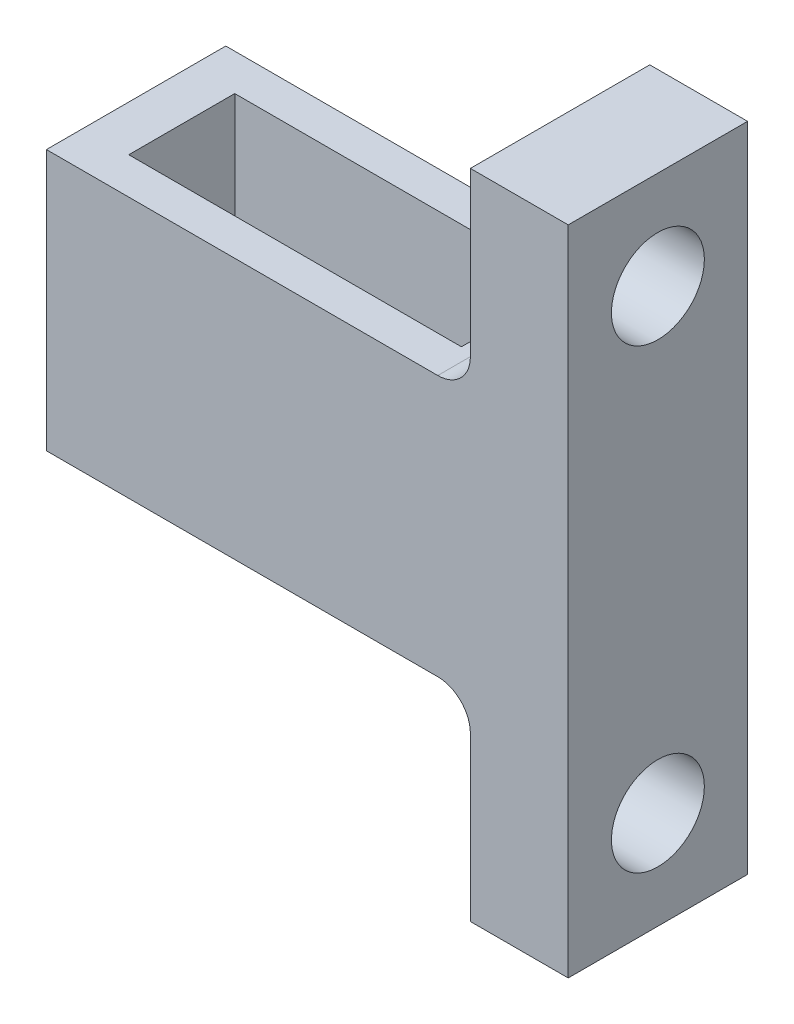
ISO-10303-21;
HEADER;
FILE_DESCRIPTION(('STEP AP214'),'2;1');
FILE_NAME('part.step','',(''),(''),'','','');
FILE_SCHEMA(('AUTOMOTIVE_DESIGN { 1 0 10303 214 1 1 1 1 }'));
ENDSEC;
DATA;
#1=APPLICATION_CONTEXT('core data for automotive mechanical design processes');
#2=APPLICATION_PROTOCOL_DEFINITION('international standard','automotive_design',2000,#1);
#3=PRODUCT_CONTEXT('',#1,'mechanical');
#4=PRODUCT('Part','Part','',(#3));
#5=PRODUCT_RELATED_PRODUCT_CATEGORY('part','',(#4));
#6=PRODUCT_DEFINITION_FORMATION('','',#4);
#7=PRODUCT_DEFINITION_CONTEXT('part definition',#1,'design');
#8=PRODUCT_DEFINITION('design','',#6,#7);
#9=PRODUCT_DEFINITION_SHAPE('','',#8);
#10=(LENGTH_UNIT() NAMED_UNIT(*) SI_UNIT(.MILLI.,.METRE.));
#11=(NAMED_UNIT(*) PLANE_ANGLE_UNIT() SI_UNIT($,.RADIAN.));
#12=(NAMED_UNIT(*) SI_UNIT($,.STERADIAN.) SOLID_ANGLE_UNIT());
#13=UNCERTAINTY_MEASURE_WITH_UNIT(LENGTH_MEASURE(1.E-05),#10,'distance_accuracy_value','');
#14=(GEOMETRIC_REPRESENTATION_CONTEXT(3) GLOBAL_UNCERTAINTY_ASSIGNED_CONTEXT((#13)) GLOBAL_UNIT_ASSIGNED_CONTEXT((#10,
#11,#12)) REPRESENTATION_CONTEXT('',''));
#15=CARTESIAN_POINT('',(0.,0.,0.));
#16=DIRECTION('',(0.,0.,1.));
#17=DIRECTION('',(1.,0.,0.));
#18=AXIS2_PLACEMENT_3D('',#15,#16,#17);
#19=CARTESIAN_POINT('',(0.,10.,0.));
#20=DIRECTION('',(0.,-1.,0.));
#21=DIRECTION('',(0.,0.,-1.));
#22=AXIS2_PLACEMENT_3D('',#19,#20,#21);
#23=PLANE('',#22);
#24=DIRECTION('',(1.,0.,0.));
#25=VECTOR('',#24,1.);
#26=CARTESIAN_POINT('',(-13.,10.,5.5));
#27=LINE('',#26,#25);
#28=CARTESIAN_POINT('',(-13.,10.,5.5));
#29=VERTEX_POINT('',#28);
#30=CARTESIAN_POINT('',(11.,10.,5.5));
#31=VERTEX_POINT('',#30);
#32=EDGE_CURVE('E367',#29,#31,#27,.T.);
#33=ORIENTED_EDGE('',*,*,#32,.T.);
#34=DIRECTION('',(0.,0.,-1.));
#35=VECTOR('',#34,1.);
#36=CARTESIAN_POINT('',(11.,10.,-5.5));
#37=LINE('',#36,#35);
#38=CARTESIAN_POINT('',(11.,10.,-5.5));
#39=VERTEX_POINT('',#38);
#40=EDGE_CURVE('E379',#31,#39,#37,.T.);
#41=ORIENTED_EDGE('',*,*,#40,.T.);
#42=DIRECTION('',(-1.,0.,0.));
#43=VECTOR('',#42,1.);
#44=CARTESIAN_POINT('',(-13.,10.,-5.5));
#45=LINE('',#44,#43);
#46=CARTESIAN_POINT('',(-13.,10.,-5.5));
#47=VERTEX_POINT('',#46);
#48=EDGE_CURVE('E363',#39,#47,#45,.T.);
#49=ORIENTED_EDGE('',*,*,#48,.T.);
#50=DIRECTION('',(0.,0.,1.));
#51=VECTOR('',#50,1.);
#52=CARTESIAN_POINT('',(-13.,10.,5.5));
#53=LINE('',#52,#51);
#54=EDGE_CURVE('E365',#47,#29,#53,.T.);
#55=ORIENTED_EDGE('',*,*,#54,.T.);
#56=EDGE_LOOP('',(#33,#41,#49,#55));
#57=FACE_BOUND('',#56,.T.);
#58=DIRECTION('',(0.,0.,-1.));
#59=VECTOR('',#58,1.);
#60=CARTESIAN_POINT('',(10.2,10.,3.25));
#61=LINE('',#60,#59);
#62=CARTESIAN_POINT('',(10.2,10.,3.25));
#63=VERTEX_POINT('',#62);
#64=CARTESIAN_POINT('',(10.2,10.,-3.25));
#65=VERTEX_POINT('',#64);
#66=EDGE_CURVE('E330',#63,#65,#61,.T.);
#67=ORIENTED_EDGE('',*,*,#66,.F.);
#68=DIRECTION('',(1.,0.,0.));
#69=VECTOR('',#68,1.);
#70=CARTESIAN_POINT('',(-10.2,10.,3.25));
#71=LINE('',#70,#69);
#72=CARTESIAN_POINT('',(-10.2,10.,3.25));
#73=VERTEX_POINT('',#72);
#74=EDGE_CURVE('E338',#73,#63,#71,.T.);
#75=ORIENTED_EDGE('',*,*,#74,.F.);
#76=DIRECTION('',(0.,0.,1.));
#77=VECTOR('',#76,1.);
#78=CARTESIAN_POINT('',(-10.2,10.,3.25));
#79=LINE('',#78,#77);
#80=CARTESIAN_POINT('',(-10.2,10.,-3.25));
#81=VERTEX_POINT('',#80);
#82=EDGE_CURVE('E335',#81,#73,#79,.T.);
#83=ORIENTED_EDGE('',*,*,#82,.F.);
#84=DIRECTION('',(-1.,0.,0.));
#85=VECTOR('',#84,1.);
#86=CARTESIAN_POINT('',(-10.2,10.,-3.25));
#87=LINE('',#86,#85);
#88=EDGE_CURVE('E332',#65,#81,#87,.T.);
#89=ORIENTED_EDGE('',*,*,#88,.F.);
#90=EDGE_LOOP('',(#67,#75,#83,#89));
#91=FACE_BOUND('',#90,.T.);
#92=ADVANCED_FACE('F36',(#57,#91),#23,.F.);
#93=CARTESIAN_POINT('',(-13.,10.,-5.5));
#94=DIRECTION('',(0.,0.,1.));
#95=DIRECTION('',(1.,0.,0.));
#96=AXIS2_PLACEMENT_3D('',#93,#94,#95);
#97=PLANE('',#96);
#98=ORIENTED_EDGE('',*,*,#48,.F.);
#99=CARTESIAN_POINT('',(11.,12.,-5.5));
#100=DIRECTION('',(0.,0.,1.));
#101=DIRECTION('',(1.,0.,0.));
#102=AXIS2_PLACEMENT_3D('',#99,#100,#101);
#103=CIRCLE('',#102,2.);
#104=CARTESIAN_POINT('',(13.,12.,-5.5));
#105=VERTEX_POINT('',#104);
#106=EDGE_CURVE('E44',#39,#105,#103,.T.);
#107=ORIENTED_EDGE('',*,*,#106,.T.);
#108=DIRECTION('',(0.,1.,0.));
#109=VECTOR('',#108,1.);
#110=CARTESIAN_POINT('',(13.,22.,-5.5));
#111=LINE('',#110,#109);
#112=CARTESIAN_POINT('',(13.,22.,-5.5));
#113=VERTEX_POINT('',#112);
#114=EDGE_CURVE('E416',#105,#113,#111,.T.);
#115=ORIENTED_EDGE('',*,*,#114,.T.);
#116=DIRECTION('',(-1.,0.,0.));
#117=VECTOR('',#116,1.);
#118=CARTESIAN_POINT('',(19.,22.,-5.5));
#119=LINE('',#118,#117);
#120=CARTESIAN_POINT('',(19.,22.,-5.5));
#121=VERTEX_POINT('',#120);
#122=EDGE_CURVE('E240',#121,#113,#119,.T.);
#123=ORIENTED_EDGE('',*,*,#122,.F.);
#124=DIRECTION('',(0.,1.,0.));
#125=VECTOR('',#124,1.);
#126=CARTESIAN_POINT('',(19.,22.,-5.5));
#127=LINE('',#126,#125);
#128=CARTESIAN_POINT('',(19.,-18.,-5.5));
#129=VERTEX_POINT('',#128);
#130=EDGE_CURVE('E217',#129,#121,#127,.T.);
#131=ORIENTED_EDGE('',*,*,#130,.F.);
#132=DIRECTION('',(-1.,0.,0.));
#133=VECTOR('',#132,1.);
#134=CARTESIAN_POINT('',(19.,-18.,-5.5));
#135=LINE('',#134,#133);
#136=CARTESIAN_POINT('',(13.,-18.,-5.5));
#137=VERTEX_POINT('',#136);
#138=EDGE_CURVE('E214',#129,#137,#135,.T.);
#139=ORIENTED_EDGE('',*,*,#138,.T.);
#140=CARTESIAN_POINT('',(13.,-8.,-5.5));
#141=VERTEX_POINT('',#140);
#142=EDGE_CURVE('E392',#137,#141,#111,.T.);
#143=ORIENTED_EDGE('',*,*,#142,.T.);
#144=CARTESIAN_POINT('',(11.,-8.,-5.5));
#145=DIRECTION('',(0.,0.,1.));
#146=DIRECTION('',(1.,0.,0.));
#147=AXIS2_PLACEMENT_3D('',#144,#145,#146);
#148=CIRCLE('',#147,2.);
#149=CARTESIAN_POINT('',(11.,-6.,-5.5));
#150=VERTEX_POINT('',#149);
#151=EDGE_CURVE('E385',#141,#150,#148,.T.);
#152=ORIENTED_EDGE('',*,*,#151,.T.);
#153=DIRECTION('',(1.,0.,0.));
#154=VECTOR('',#153,1.);
#155=CARTESIAN_POINT('',(-13.,-6.,-5.5));
#156=LINE('',#155,#154);
#157=CARTESIAN_POINT('',(-13.,-6.,-5.5));
#158=VERTEX_POINT('',#157);
#159=EDGE_CURVE('E324',#158,#150,#156,.T.);
#160=ORIENTED_EDGE('',*,*,#159,.F.);
#161=DIRECTION('',(0.,-1.,0.));
#162=VECTOR('',#161,1.);
#163=CARTESIAN_POINT('',(-13.,10.,-5.5));
#164=LINE('',#163,#162);
#165=EDGE_CURVE('E372',#47,#158,#164,.T.);
#166=ORIENTED_EDGE('',*,*,#165,.F.);
#167=EDGE_LOOP('',(#98,#107,#115,#123,#131,#139,#143,#152,#160,#166));
#168=FACE_BOUND('',#167,.T.);
#169=ADVANCED_FACE('F389',(#168),#97,.F.);
#170=CARTESIAN_POINT('',(-13.,10.,5.5));
#171=DIRECTION('',(1.,0.,0.));
#172=DIRECTION('',(0.,0.,-1.));
#173=AXIS2_PLACEMENT_3D('',#170,#171,#172);
#174=PLANE('',#173);
#175=ORIENTED_EDGE('',*,*,#165,.T.);
#176=DIRECTION('',(0.,0.,-1.));
#177=VECTOR('',#176,1.);
#178=CARTESIAN_POINT('',(-13.,-6.,5.5));
#179=LINE('',#178,#177);
#180=CARTESIAN_POINT('',(-13.,-6.,5.5));
#181=VERTEX_POINT('',#180);
#182=EDGE_CURVE('E321',#181,#158,#179,.T.);
#183=ORIENTED_EDGE('',*,*,#182,.F.);
#184=DIRECTION('',(0.,-1.,0.));
#185=VECTOR('',#184,1.);
#186=CARTESIAN_POINT('',(-13.,10.,5.5));
#187=LINE('',#186,#185);
#188=EDGE_CURVE('E370',#29,#181,#187,.T.);
#189=ORIENTED_EDGE('',*,*,#188,.F.);
#190=ORIENTED_EDGE('',*,*,#54,.F.);
#191=EDGE_LOOP('',(#175,#183,#189,#190));
#192=FACE_BOUND('',#191,.T.);
#193=ADVANCED_FACE('F436',(#192),#174,.F.);
#194=CARTESIAN_POINT('',(-13.,10.,5.5));
#195=DIRECTION('',(0.,0.,-1.));
#196=DIRECTION('',(-1.,0.,0.));
#197=AXIS2_PLACEMENT_3D('',#194,#195,#196);
#198=PLANE('',#197);
#199=ORIENTED_EDGE('',*,*,#188,.T.);
#200=DIRECTION('',(-1.,0.,0.));
#201=VECTOR('',#200,1.);
#202=CARTESIAN_POINT('',(-13.,-6.,5.5));
#203=LINE('',#202,#201);
#204=CARTESIAN_POINT('',(11.,-6.,5.5));
#205=VERTEX_POINT('',#204);
#206=EDGE_CURVE('E327',#205,#181,#203,.T.);
#207=ORIENTED_EDGE('',*,*,#206,.F.);
#208=CARTESIAN_POINT('',(11.,-8.,5.5));
#209=DIRECTION('',(0.,0.,-1.));
#210=DIRECTION('',(-1.,0.,0.));
#211=AXIS2_PLACEMENT_3D('',#208,#209,#210);
#212=CIRCLE('',#211,2.);
#213=CARTESIAN_POINT('',(13.,-8.,5.5));
#214=VERTEX_POINT('',#213);
#215=EDGE_CURVE('E383',#205,#214,#212,.T.);
#216=ORIENTED_EDGE('',*,*,#215,.T.);
#217=DIRECTION('',(0.,-1.,0.));
#218=VECTOR('',#217,1.);
#219=CARTESIAN_POINT('',(13.,22.,5.50000000000001));
#220=LINE('',#219,#218);
#221=CARTESIAN_POINT('',(13.,-18.,5.5));
#222=VERTEX_POINT('',#221);
#223=EDGE_CURVE('E233',#214,#222,#220,.T.);
#224=ORIENTED_EDGE('',*,*,#223,.T.);
#225=DIRECTION('',(-1.,0.,0.));
#226=VECTOR('',#225,1.);
#227=CARTESIAN_POINT('',(19.,-18.,5.5));
#228=LINE('',#227,#226);
#229=CARTESIAN_POINT('',(19.,-18.,5.5));
#230=VERTEX_POINT('',#229);
#231=EDGE_CURVE('E212',#230,#222,#228,.T.);
#232=ORIENTED_EDGE('',*,*,#231,.F.);
#233=DIRECTION('',(0.,-1.,0.));
#234=VECTOR('',#233,1.);
#235=CARTESIAN_POINT('',(19.,22.,5.50000000000001));
#236=LINE('',#235,#234);
#237=CARTESIAN_POINT('',(19.,22.,5.50000000000001));
#238=VERTEX_POINT('',#237);
#239=EDGE_CURVE('E218',#238,#230,#236,.T.);
#240=ORIENTED_EDGE('',*,*,#239,.F.);
#241=DIRECTION('',(-1.,0.,0.));
#242=VECTOR('',#241,1.);
#243=CARTESIAN_POINT('',(19.,22.,5.50000000000001));
#244=LINE('',#243,#242);
#245=CARTESIAN_POINT('',(13.,22.,5.50000000000001));
#246=VERTEX_POINT('',#245);
#247=EDGE_CURVE('E419',#238,#246,#244,.T.);
#248=ORIENTED_EDGE('',*,*,#247,.T.);
#249=CARTESIAN_POINT('',(13.,12.,5.50000000000001));
#250=VERTEX_POINT('',#249);
#251=EDGE_CURVE('E406',#246,#250,#220,.T.);
#252=ORIENTED_EDGE('',*,*,#251,.T.);
#253=CARTESIAN_POINT('',(11.,12.,5.5));
#254=DIRECTION('',(0.,0.,-1.));
#255=DIRECTION('',(-1.,0.,0.));
#256=AXIS2_PLACEMENT_3D('',#253,#254,#255);
#257=CIRCLE('',#256,2.);
#258=EDGE_CURVE('E11',#250,#31,#257,.T.);
#259=ORIENTED_EDGE('',*,*,#258,.T.);
#260=ORIENTED_EDGE('',*,*,#32,.F.);
#261=EDGE_LOOP('',(#199,#207,#216,#224,#232,#240,#248,#252,#259,#260));
#262=FACE_BOUND('',#261,.T.);
#263=ADVANCED_FACE('F231',(#262),#198,.F.);
#264=CARTESIAN_POINT('',(10.2,10.,3.25));
#265=DIRECTION('',(-1.,0.,0.));
#266=DIRECTION('',(0.,0.,1.));
#267=AXIS2_PLACEMENT_3D('',#264,#265,#266);
#268=PLANE('',#267);
#269=DIRECTION('',(0.,0.,-1.));
#270=VECTOR('',#269,1.);
#271=CARTESIAN_POINT('',(10.2,0.,3.25));
#272=LINE('',#271,#270);
#273=CARTESIAN_POINT('',(10.2,0.,3.25));
#274=VERTEX_POINT('',#273);
#275=CARTESIAN_POINT('',(10.2,0.,-3.25));
#276=VERTEX_POINT('',#275);
#277=EDGE_CURVE('E329',#274,#276,#272,.T.);
#278=ORIENTED_EDGE('',*,*,#277,.F.);
#279=DIRECTION('',(0.,-1.,0.));
#280=VECTOR('',#279,1.);
#281=CARTESIAN_POINT('',(10.2,10.,3.25));
#282=LINE('',#281,#280);
#283=EDGE_CURVE('E340',#63,#274,#282,.T.);
#284=ORIENTED_EDGE('',*,*,#283,.F.);
#285=ORIENTED_EDGE('',*,*,#66,.T.);
#286=DIRECTION('',(0.,-1.,0.));
#287=VECTOR('',#286,1.);
#288=CARTESIAN_POINT('',(10.2,10.,-3.25));
#289=LINE('',#288,#287);
#290=EDGE_CURVE('E360',#65,#276,#289,.T.);
#291=ORIENTED_EDGE('',*,*,#290,.T.);
#292=EDGE_LOOP('',(#278,#284,#285,#291));
#293=FACE_BOUND('',#292,.T.);
#294=ADVANCED_FACE('F443',(#293),#268,.T.);
#295=CARTESIAN_POINT('',(-10.2,10.,-3.25));
#296=DIRECTION('',(0.,0.,1.));
#297=DIRECTION('',(1.,0.,0.));
#298=AXIS2_PLACEMENT_3D('',#295,#296,#297);
#299=PLANE('',#298);
#300=DIRECTION('',(-1.,0.,0.));
#301=VECTOR('',#300,1.);
#302=CARTESIAN_POINT('',(-10.2,0.,-3.25));
#303=LINE('',#302,#301);
#304=CARTESIAN_POINT('',(8.7,0.,-3.25));
#305=VERTEX_POINT('',#304);
#306=EDGE_CURVE('E344',#276,#305,#303,.T.);
#307=ORIENTED_EDGE('',*,*,#306,.F.);
#308=ORIENTED_EDGE('',*,*,#290,.F.);
#309=ORIENTED_EDGE('',*,*,#88,.T.);
#310=DIRECTION('',(0.,-1.,0.));
#311=VECTOR('',#310,1.);
#312=CARTESIAN_POINT('',(-10.2,10.,-3.25));
#313=LINE('',#312,#311);
#314=CARTESIAN_POINT('',(-10.2,0.,-3.25));
#315=VERTEX_POINT('',#314);
#316=EDGE_CURVE('E358',#81,#315,#313,.T.);
#317=ORIENTED_EDGE('',*,*,#316,.T.);
#318=CARTESIAN_POINT('',(-8.7,0.,-3.25));
#319=VERTEX_POINT('',#318);
#320=EDGE_CURVE('E343',#319,#315,#303,.T.);
#321=ORIENTED_EDGE('',*,*,#320,.F.);
#322=DIRECTION('',(0.,1.,0.));
#323=VECTOR('',#322,1.);
#324=CARTESIAN_POINT('',(-8.7,-6.,-3.25));
#325=LINE('',#324,#323);
#326=CARTESIAN_POINT('',(-8.7,-6.,-3.25));
#327=VERTEX_POINT('',#326);
#328=EDGE_CURVE('E318',#327,#319,#325,.T.);
#329=ORIENTED_EDGE('',*,*,#328,.F.);
#330=DIRECTION('',(1.,0.,0.));
#331=VECTOR('',#330,1.);
#332=CARTESIAN_POINT('',(-8.7,-6.,-3.25));
#333=LINE('',#332,#331);
#334=CARTESIAN_POINT('',(-6.2,-6.,-3.25));
#335=VERTEX_POINT('',#334);
#336=EDGE_CURVE('E297',#327,#335,#333,.T.);
#337=ORIENTED_EDGE('',*,*,#336,.T.);
#338=DIRECTION('',(0.,1.,0.));
#339=VECTOR('',#338,1.);
#340=CARTESIAN_POINT('',(-6.2,-6.,-3.25));
#341=LINE('',#340,#339);
#342=CARTESIAN_POINT('',(-6.2,0.,-3.25));
#343=VERTEX_POINT('',#342);
#344=EDGE_CURVE('E315',#335,#343,#341,.T.);
#345=ORIENTED_EDGE('',*,*,#344,.T.);
#346=CARTESIAN_POINT('',(-1.5,0.,-3.25));
#347=VERTEX_POINT('',#346);
#348=EDGE_CURVE('E808',#347,#343,#303,.T.);
#349=ORIENTED_EDGE('',*,*,#348,.F.);
#350=DIRECTION('',(0.,1.,0.));
#351=VECTOR('',#350,1.);
#352=CARTESIAN_POINT('',(-1.5,-6.,-3.25));
#353=LINE('',#352,#351);
#354=CARTESIAN_POINT('',(-1.5,-6.,-3.25));
#355=VERTEX_POINT('',#354);
#356=EDGE_CURVE('E291',#355,#347,#353,.T.);
#357=ORIENTED_EDGE('',*,*,#356,.F.);
#358=DIRECTION('',(1.,0.,0.));
#359=VECTOR('',#358,1.);
#360=CARTESIAN_POINT('',(-1.5,-6.,-3.25));
#361=LINE('',#360,#359);
#362=CARTESIAN_POINT('',(0.999999999999999,-6.,-3.25));
#363=VERTEX_POINT('',#362);
#364=EDGE_CURVE('E270',#355,#363,#361,.T.);
#365=ORIENTED_EDGE('',*,*,#364,.T.);
#366=DIRECTION('',(0.,1.,0.));
#367=VECTOR('',#366,1.);
#368=CARTESIAN_POINT('',(0.999999999999999,-6.,-3.25));
#369=LINE('',#368,#367);
#370=CARTESIAN_POINT('',(0.999999999999997,0.,-3.25));
#371=VERTEX_POINT('',#370);
#372=EDGE_CURVE('E288',#363,#371,#369,.T.);
#373=ORIENTED_EDGE('',*,*,#372,.T.);
#374=CARTESIAN_POINT('',(6.2,0.,-3.25));
#375=VERTEX_POINT('',#374);
#376=EDGE_CURVE('E347',#375,#371,#303,.T.);
#377=ORIENTED_EDGE('',*,*,#376,.F.);
#378=DIRECTION('',(0.,1.,0.));
#379=VECTOR('',#378,1.);
#380=CARTESIAN_POINT('',(6.2,-6.,-3.25));
#381=LINE('',#380,#379);
#382=CARTESIAN_POINT('',(6.2,-6.,-3.25));
#383=VERTEX_POINT('',#382);
#384=EDGE_CURVE('E264',#383,#375,#381,.T.);
#385=ORIENTED_EDGE('',*,*,#384,.F.);
#386=DIRECTION('',(1.,0.,0.));
#387=VECTOR('',#386,1.);
#388=CARTESIAN_POINT('',(6.2,-6.,-3.25));
#389=LINE('',#388,#387);
#390=CARTESIAN_POINT('',(8.7,-6.,-3.25));
#391=VERTEX_POINT('',#390);
#392=EDGE_CURVE('E246',#383,#391,#389,.T.);
#393=ORIENTED_EDGE('',*,*,#392,.T.);
#394=DIRECTION('',(0.,1.,0.));
#395=VECTOR('',#394,1.);
#396=CARTESIAN_POINT('',(8.7,-6.,-3.25));
#397=LINE('',#396,#395);
#398=EDGE_CURVE('E261',#391,#305,#397,.T.);
#399=ORIENTED_EDGE('',*,*,#398,.T.);
#400=EDGE_LOOP('',(#307,#308,#309,#317,#321,#329,#337,#345,#349,#357,#365,#373,#377,#385,#393,#399));
#401=FACE_BOUND('',#400,.T.);
#402=ADVANCED_FACE('F453',(#401),#299,.T.);
#403=CARTESIAN_POINT('',(-10.2,10.,3.25));
#404=DIRECTION('',(1.,0.,0.));
#405=DIRECTION('',(0.,0.,-1.));
#406=AXIS2_PLACEMENT_3D('',#403,#404,#405);
#407=PLANE('',#406);
#408=DIRECTION('',(0.,0.,1.));
#409=VECTOR('',#408,1.);
#410=CARTESIAN_POINT('',(-10.2,0.,3.25));
#411=LINE('',#410,#409);
#412=CARTESIAN_POINT('',(-10.2,0.,3.25));
#413=VERTEX_POINT('',#412);
#414=EDGE_CURVE('E346',#315,#413,#411,.T.);
#415=ORIENTED_EDGE('',*,*,#414,.F.);
#416=ORIENTED_EDGE('',*,*,#316,.F.);
#417=ORIENTED_EDGE('',*,*,#82,.T.);
#418=DIRECTION('',(0.,-1.,0.));
#419=VECTOR('',#418,1.);
#420=CARTESIAN_POINT('',(-10.2,10.,3.25));
#421=LINE('',#420,#419);
#422=EDGE_CURVE('E355',#73,#413,#421,.T.);
#423=ORIENTED_EDGE('',*,*,#422,.T.);
#424=EDGE_LOOP('',(#415,#416,#417,#423));
#425=FACE_BOUND('',#424,.T.);
#426=ADVANCED_FACE('F457',(#425),#407,.T.);
#427=CARTESIAN_POINT('',(-10.2,10.,3.25));
#428=DIRECTION('',(0.,0.,-1.));
#429=DIRECTION('',(-1.,0.,0.));
#430=AXIS2_PLACEMENT_3D('',#427,#428,#429);
#431=PLANE('',#430);
#432=DIRECTION('',(1.,0.,0.));
#433=VECTOR('',#432,1.);
#434=CARTESIAN_POINT('',(-10.2,0.,3.25));
#435=LINE('',#434,#433);
#436=CARTESIAN_POINT('',(-8.7,0.,3.25));
#437=VERTEX_POINT('',#436);
#438=EDGE_CURVE('E333',#413,#437,#435,.T.);
#439=ORIENTED_EDGE('',*,*,#438,.F.);
#440=ORIENTED_EDGE('',*,*,#422,.F.);
#441=ORIENTED_EDGE('',*,*,#74,.T.);
#442=ORIENTED_EDGE('',*,*,#283,.T.);
#443=CARTESIAN_POINT('',(8.7,0.,3.25));
#444=VERTEX_POINT('',#443);
#445=EDGE_CURVE('E350',#444,#274,#435,.T.);
#446=ORIENTED_EDGE('',*,*,#445,.F.);
#447=DIRECTION('',(0.,1.,0.));
#448=VECTOR('',#447,1.);
#449=CARTESIAN_POINT('',(8.7,-6.,3.25));
#450=LINE('',#449,#448);
#451=CARTESIAN_POINT('',(8.7,-6.,3.25));
#452=VERTEX_POINT('',#451);
#453=EDGE_CURVE('E258',#452,#444,#450,.T.);
#454=ORIENTED_EDGE('',*,*,#453,.F.);
#455=DIRECTION('',(-1.,0.,0.));
#456=VECTOR('',#455,1.);
#457=CARTESIAN_POINT('',(6.2,-6.,3.25));
#458=LINE('',#457,#456);
#459=CARTESIAN_POINT('',(6.2,-6.,3.25));
#460=VERTEX_POINT('',#459);
#461=EDGE_CURVE('E251',#452,#460,#458,.T.);
#462=ORIENTED_EDGE('',*,*,#461,.T.);
#463=DIRECTION('',(0.,1.,0.));
#464=VECTOR('',#463,1.);
#465=CARTESIAN_POINT('',(6.2,-6.,3.25));
#466=LINE('',#465,#464);
#467=CARTESIAN_POINT('',(6.2,0.,3.25));
#468=VERTEX_POINT('',#467);
#469=EDGE_CURVE('E252',#460,#468,#466,.T.);
#470=ORIENTED_EDGE('',*,*,#469,.T.);
#471=CARTESIAN_POINT('',(0.999999999999997,0.,3.25));
#472=VERTEX_POINT('',#471);
#473=EDGE_CURVE('E791',#472,#468,#435,.T.);
#474=ORIENTED_EDGE('',*,*,#473,.F.);
#475=DIRECTION('',(0.,1.,0.));
#476=VECTOR('',#475,1.);
#477=CARTESIAN_POINT('',(0.999999999999997,-6.,3.25));
#478=LINE('',#477,#476);
#479=CARTESIAN_POINT('',(0.999999999999997,-6.,3.25));
#480=VERTEX_POINT('',#479);
#481=EDGE_CURVE('E285',#480,#472,#478,.T.);
#482=ORIENTED_EDGE('',*,*,#481,.F.);
#483=DIRECTION('',(-1.,0.,0.));
#484=VECTOR('',#483,1.);
#485=CARTESIAN_POINT('',(-1.5,-6.,3.25));
#486=LINE('',#485,#484);
#487=CARTESIAN_POINT('',(-1.5,-6.,3.25));
#488=VERTEX_POINT('',#487);
#489=EDGE_CURVE('E276',#480,#488,#486,.T.);
#490=ORIENTED_EDGE('',*,*,#489,.T.);
#491=DIRECTION('',(0.,1.,0.));
#492=VECTOR('',#491,1.);
#493=CARTESIAN_POINT('',(-1.5,-6.,3.25));
#494=LINE('',#493,#492);
#495=CARTESIAN_POINT('',(-1.5,0.,3.25));
#496=VERTEX_POINT('',#495);
#497=EDGE_CURVE('E278',#488,#496,#494,.T.);
#498=ORIENTED_EDGE('',*,*,#497,.T.);
#499=CARTESIAN_POINT('',(-6.2,0.,3.25));
#500=VERTEX_POINT('',#499);
#501=EDGE_CURVE('E352',#500,#496,#435,.T.);
#502=ORIENTED_EDGE('',*,*,#501,.F.);
#503=DIRECTION('',(0.,1.,0.));
#504=VECTOR('',#503,1.);
#505=CARTESIAN_POINT('',(-6.2,-6.,3.25));
#506=LINE('',#505,#504);
#507=CARTESIAN_POINT('',(-6.2,-6.,3.25));
#508=VERTEX_POINT('',#507);
#509=EDGE_CURVE('E312',#508,#500,#506,.T.);
#510=ORIENTED_EDGE('',*,*,#509,.F.);
#511=DIRECTION('',(-1.,0.,0.));
#512=VECTOR('',#511,1.);
#513=CARTESIAN_POINT('',(-8.7,-6.,3.25));
#514=LINE('',#513,#512);
#515=CARTESIAN_POINT('',(-8.7,-6.,3.25));
#516=VERTEX_POINT('',#515);
#517=EDGE_CURVE('E303',#508,#516,#514,.T.);
#518=ORIENTED_EDGE('',*,*,#517,.T.);
#519=DIRECTION('',(0.,1.,0.));
#520=VECTOR('',#519,1.);
#521=CARTESIAN_POINT('',(-8.7,-6.,3.25));
#522=LINE('',#521,#520);
#523=EDGE_CURVE('E305',#516,#437,#522,.T.);
#524=ORIENTED_EDGE('',*,*,#523,.T.);
#525=EDGE_LOOP('',(#439,#440,#441,#442,#446,#454,#462,#470,#474,#482,#490,#498,#502,#510,#518,#524));
#526=FACE_BOUND('',#525,.T.);
#527=ADVANCED_FACE('F461',(#526),#431,.T.);
#528=CARTESIAN_POINT('',(0.,0.,0.));
#529=DIRECTION('',(0.,-1.,0.));
#530=DIRECTION('',(0.,0.,-1.));
#531=AXIS2_PLACEMENT_3D('',#528,#529,#530);
#532=PLANE('',#531);
#533=DIRECTION('',(0.,0.,1.));
#534=VECTOR('',#533,1.);
#535=CARTESIAN_POINT('',(-6.2,0.,3.25));
#536=LINE('',#535,#534);
#537=EDGE_CURVE('E298',#343,#500,#536,.T.);
#538=ORIENTED_EDGE('',*,*,#537,.T.);
#539=ORIENTED_EDGE('',*,*,#501,.T.);
#540=DIRECTION('',(0.,0.,-1.));
#541=VECTOR('',#540,1.);
#542=CARTESIAN_POINT('',(-1.5,0.,3.25));
#543=LINE('',#542,#541);
#544=EDGE_CURVE('E267',#496,#347,#543,.T.);
#545=ORIENTED_EDGE('',*,*,#544,.T.);
#546=ORIENTED_EDGE('',*,*,#348,.T.);
#547=EDGE_LOOP('',(#538,#539,#545,#546));
#548=FACE_BOUND('',#547,.T.);
#549=ADVANCED_FACE('F465',(#548),#532,.F.);
#550=DIRECTION('',(0.,0.,1.));
#551=VECTOR('',#550,1.);
#552=CARTESIAN_POINT('',(0.999999999999997,0.,3.25));
#553=LINE('',#552,#551);
#554=EDGE_CURVE('E271',#371,#472,#553,.T.);
#555=ORIENTED_EDGE('',*,*,#554,.T.);
#556=ORIENTED_EDGE('',*,*,#473,.T.);
#557=DIRECTION('',(0.,0.,-1.));
#558=VECTOR('',#557,1.);
#559=CARTESIAN_POINT('',(6.2,0.,3.25));
#560=LINE('',#559,#558);
#561=EDGE_CURVE('E235',#468,#375,#560,.T.);
#562=ORIENTED_EDGE('',*,*,#561,.T.);
#563=ORIENTED_EDGE('',*,*,#376,.T.);
#564=EDGE_LOOP('',(#555,#556,#562,#563));
#565=FACE_BOUND('',#564,.T.);
#566=ADVANCED_FACE('F469',(#565),#532,.F.);
#567=DIRECTION('',(0.,0.,1.));
#568=VECTOR('',#567,1.);
#569=CARTESIAN_POINT('',(8.7,0.,3.25));
#570=LINE('',#569,#568);
#571=EDGE_CURVE('E238',#305,#444,#570,.T.);
#572=ORIENTED_EDGE('',*,*,#571,.T.);
#573=ORIENTED_EDGE('',*,*,#445,.T.);
#574=ORIENTED_EDGE('',*,*,#277,.T.);
#575=ORIENTED_EDGE('',*,*,#306,.T.);
#576=EDGE_LOOP('',(#572,#573,#574,#575));
#577=FACE_BOUND('',#576,.T.);
#578=ADVANCED_FACE('F686',(#577),#532,.F.);
#579=ORIENTED_EDGE('',*,*,#414,.T.);
#580=ORIENTED_EDGE('',*,*,#438,.T.);
#581=DIRECTION('',(0.,0.,-1.));
#582=VECTOR('',#581,1.);
#583=CARTESIAN_POINT('',(-8.7,0.,3.25));
#584=LINE('',#583,#582);
#585=EDGE_CURVE('E294',#437,#319,#584,.T.);
#586=ORIENTED_EDGE('',*,*,#585,.T.);
#587=ORIENTED_EDGE('',*,*,#320,.T.);
#588=EDGE_LOOP('',(#579,#580,#586,#587));
#589=FACE_BOUND('',#588,.T.);
#590=ADVANCED_FACE('F471',(#589),#532,.F.);
#591=CARTESIAN_POINT('',(0.,-6.,0.));
#592=DIRECTION('',(0.,-1.,0.));
#593=DIRECTION('',(0.,0.,-1.));
#594=AXIS2_PLACEMENT_3D('',#591,#592,#593);
#595=PLANE('',#594);
#596=ORIENTED_EDGE('',*,*,#159,.T.);
#597=DIRECTION('',(0.,0.,1.));
#598=VECTOR('',#597,1.);
#599=CARTESIAN_POINT('',(11.,-6.,0.));
#600=LINE('',#599,#598);
#601=EDGE_CURVE('E374',#150,#205,#600,.T.);
#602=ORIENTED_EDGE('',*,*,#601,.T.);
#603=ORIENTED_EDGE('',*,*,#206,.T.);
#604=ORIENTED_EDGE('',*,*,#182,.T.);
#605=EDGE_LOOP('',(#596,#602,#603,#604));
#606=FACE_BOUND('',#605,.T.);
#607=ORIENTED_EDGE('',*,*,#336,.F.);
#608=DIRECTION('',(0.,0.,-1.));
#609=VECTOR('',#608,1.);
#610=CARTESIAN_POINT('',(-8.7,-6.,3.25));
#611=LINE('',#610,#609);
#612=EDGE_CURVE('E295',#516,#327,#611,.T.);
#613=ORIENTED_EDGE('',*,*,#612,.F.);
#614=ORIENTED_EDGE('',*,*,#517,.F.);
#615=DIRECTION('',(0.,0.,1.));
#616=VECTOR('',#615,1.);
#617=CARTESIAN_POINT('',(-6.2,-6.,3.25));
#618=LINE('',#617,#616);
#619=EDGE_CURVE('E300',#335,#508,#618,.T.);
#620=ORIENTED_EDGE('',*,*,#619,.F.);
#621=EDGE_LOOP('',(#607,#613,#614,#620));
#622=FACE_BOUND('',#621,.T.);
#623=ORIENTED_EDGE('',*,*,#364,.F.);
#624=DIRECTION('',(0.,0.,-1.));
#625=VECTOR('',#624,1.);
#626=CARTESIAN_POINT('',(-1.5,-6.,3.25));
#627=LINE('',#626,#625);
#628=EDGE_CURVE('E268',#488,#355,#627,.T.);
#629=ORIENTED_EDGE('',*,*,#628,.F.);
#630=ORIENTED_EDGE('',*,*,#489,.F.);
#631=DIRECTION('',(0.,0.,1.));
#632=VECTOR('',#631,1.);
#633=CARTESIAN_POINT('',(0.999999999999997,-6.,3.25));
#634=LINE('',#633,#632);
#635=EDGE_CURVE('E273',#363,#480,#634,.T.);
#636=ORIENTED_EDGE('',*,*,#635,.F.);
#637=EDGE_LOOP('',(#623,#629,#630,#636));
#638=FACE_BOUND('',#637,.T.);
#639=ORIENTED_EDGE('',*,*,#392,.F.);
#640=DIRECTION('',(0.,0.,-1.));
#641=VECTOR('',#640,1.);
#642=CARTESIAN_POINT('',(6.2,-6.,3.25));
#643=LINE('',#642,#641);
#644=EDGE_CURVE('E244',#460,#383,#643,.T.);
#645=ORIENTED_EDGE('',*,*,#644,.F.);
#646=ORIENTED_EDGE('',*,*,#461,.F.);
#647=DIRECTION('',(0.,0.,1.));
#648=VECTOR('',#647,1.);
#649=CARTESIAN_POINT('',(8.7,-6.,3.25));
#650=LINE('',#649,#648);
#651=EDGE_CURVE('E248',#391,#452,#650,.T.);
#652=ORIENTED_EDGE('',*,*,#651,.F.);
#653=EDGE_LOOP('',(#639,#645,#646,#652));
#654=FACE_BOUND('',#653,.T.);
#655=ADVANCED_FACE('F397',(#606,#622,#638,#654),#595,.T.);
#656=CARTESIAN_POINT('',(-8.7,-6.,3.25));
#657=DIRECTION('',(1.,0.,0.));
#658=DIRECTION('',(0.,0.,-1.));
#659=AXIS2_PLACEMENT_3D('',#656,#657,#658);
#660=PLANE('',#659);
#661=ORIENTED_EDGE('',*,*,#585,.F.);
#662=ORIENTED_EDGE('',*,*,#523,.F.);
#663=ORIENTED_EDGE('',*,*,#612,.T.);
#664=ORIENTED_EDGE('',*,*,#328,.T.);
#665=EDGE_LOOP('',(#661,#662,#663,#664));
#666=FACE_BOUND('',#665,.T.);
#667=ADVANCED_FACE('F474',(#666),#660,.T.);
#668=CARTESIAN_POINT('',(-6.2,-6.,3.25));
#669=DIRECTION('',(-1.,0.,0.));
#670=DIRECTION('',(0.,0.,1.));
#671=AXIS2_PLACEMENT_3D('',#668,#669,#670);
#672=PLANE('',#671);
#673=ORIENTED_EDGE('',*,*,#537,.F.);
#674=ORIENTED_EDGE('',*,*,#344,.F.);
#675=ORIENTED_EDGE('',*,*,#619,.T.);
#676=ORIENTED_EDGE('',*,*,#509,.T.);
#677=EDGE_LOOP('',(#673,#674,#675,#676));
#678=FACE_BOUND('',#677,.T.);
#679=ADVANCED_FACE('F477',(#678),#672,.T.);
#680=CARTESIAN_POINT('',(-1.5,-6.,3.25));
#681=DIRECTION('',(1.,0.,0.));
#682=DIRECTION('',(0.,0.,-1.));
#683=AXIS2_PLACEMENT_3D('',#680,#681,#682);
#684=PLANE('',#683);
#685=ORIENTED_EDGE('',*,*,#544,.F.);
#686=ORIENTED_EDGE('',*,*,#497,.F.);
#687=ORIENTED_EDGE('',*,*,#628,.T.);
#688=ORIENTED_EDGE('',*,*,#356,.T.);
#689=EDGE_LOOP('',(#685,#686,#687,#688));
#690=FACE_BOUND('',#689,.T.);
#691=ADVANCED_FACE('F481',(#690),#684,.T.);
#692=CARTESIAN_POINT('',(0.999999999999997,-6.,3.25));
#693=DIRECTION('',(-1.,0.,0.));
#694=DIRECTION('',(0.,0.,1.));
#695=AXIS2_PLACEMENT_3D('',#692,#693,#694);
#696=PLANE('',#695);
#697=ORIENTED_EDGE('',*,*,#554,.F.);
#698=ORIENTED_EDGE('',*,*,#372,.F.);
#699=ORIENTED_EDGE('',*,*,#635,.T.);
#700=ORIENTED_EDGE('',*,*,#481,.T.);
#701=EDGE_LOOP('',(#697,#698,#699,#700));
#702=FACE_BOUND('',#701,.T.);
#703=ADVANCED_FACE('F485',(#702),#696,.T.);
#704=CARTESIAN_POINT('',(6.2,-6.,3.25));
#705=DIRECTION('',(1.,0.,0.));
#706=DIRECTION('',(0.,0.,-1.));
#707=AXIS2_PLACEMENT_3D('',#704,#705,#706);
#708=PLANE('',#707);
#709=ORIENTED_EDGE('',*,*,#561,.F.);
#710=ORIENTED_EDGE('',*,*,#469,.F.);
#711=ORIENTED_EDGE('',*,*,#644,.T.);
#712=ORIENTED_EDGE('',*,*,#384,.T.);
#713=EDGE_LOOP('',(#709,#710,#711,#712));
#714=FACE_BOUND('',#713,.T.);
#715=ADVANCED_FACE('F489',(#714),#708,.T.);
#716=CARTESIAN_POINT('',(8.7,-6.,3.25));
#717=DIRECTION('',(-1.,0.,0.));
#718=DIRECTION('',(0.,0.,1.));
#719=AXIS2_PLACEMENT_3D('',#716,#717,#718);
#720=PLANE('',#719);
#721=ORIENTED_EDGE('',*,*,#571,.F.);
#722=ORIENTED_EDGE('',*,*,#398,.F.);
#723=ORIENTED_EDGE('',*,*,#651,.T.);
#724=ORIENTED_EDGE('',*,*,#453,.T.);
#725=EDGE_LOOP('',(#721,#722,#723,#724));
#726=FACE_BOUND('',#725,.T.);
#727=ADVANCED_FACE('F493',(#726),#720,.T.);
#728=CARTESIAN_POINT('',(13.,0.,0.));
#729=DIRECTION('',(1.,0.,0.));
#730=DIRECTION('',(0.,0.,-1.));
#731=AXIS2_PLACEMENT_3D('',#728,#729,#730);
#732=PLANE('',#731);
#733=ORIENTED_EDGE('',*,*,#223,.F.);
#734=DIRECTION('',(0.,0.,1.));
#735=VECTOR('',#734,1.);
#736=CARTESIAN_POINT('',(13.,-8.,0.));
#737=LINE('',#736,#735);
#738=EDGE_CURVE('E377',#214,#141,#737,.F.);
#739=ORIENTED_EDGE('',*,*,#738,.T.);
#740=ORIENTED_EDGE('',*,*,#142,.F.);
#741=DIRECTION('',(0.,0.,-1.));
#742=VECTOR('',#741,1.);
#743=CARTESIAN_POINT('',(13.,-18.,5.5));
#744=LINE('',#743,#742);
#745=EDGE_CURVE('E405',#222,#137,#744,.T.);
#746=ORIENTED_EDGE('',*,*,#745,.F.);
#747=EDGE_LOOP('',(#733,#739,#740,#746));
#748=FACE_BOUND('',#747,.T.);
#749=CARTESIAN_POINT('',(13.,-11.9957579174975,0.));
#750=DIRECTION('',(1.,0.,0.));
#751=DIRECTION('',(0.,0.,-1.));
#752=AXIS2_PLACEMENT_3D('',#749,#750,#751);
#753=CIRCLE('',#752,2.85);
#754=CARTESIAN_POINT('',(13.,-11.9957579174975,-2.85));
#755=VERTEX_POINT('',#754);
#756=EDGE_CURVE('E410',#755,#755,#753,.T.);
#757=ORIENTED_EDGE('',*,*,#756,.T.);
#758=EDGE_LOOP('',(#757));
#759=FACE_BOUND('',#758,.T.);
#760=ADVANCED_FACE('F403',(#748,#759),#732,.F.);
#761=CARTESIAN_POINT('',(19.,0.,0.));
#762=DIRECTION('',(1.,0.,0.));
#763=DIRECTION('',(0.,0.,-1.));
#764=AXIS2_PLACEMENT_3D('',#761,#762,#763);
#765=PLANE('',#764);
#766=CARTESIAN_POINT('',(19.,-11.9957579174975,0.));
#767=DIRECTION('',(1.,0.,0.));
#768=DIRECTION('',(0.,0.,-1.));
#769=AXIS2_PLACEMENT_3D('',#766,#767,#768);
#770=CIRCLE('',#769,2.85);
#771=CARTESIAN_POINT('',(19.,-11.9957579174975,-2.85));
#772=VERTEX_POINT('',#771);
#773=EDGE_CURVE('E407',#772,#772,#770,.T.);
#774=ORIENTED_EDGE('',*,*,#773,.F.);
#775=EDGE_LOOP('',(#774));
#776=FACE_BOUND('',#775,.T.);
#777=ORIENTED_EDGE('',*,*,#239,.T.);
#778=DIRECTION('',(0.,0.,-1.));
#779=VECTOR('',#778,1.);
#780=CARTESIAN_POINT('',(19.,-18.,5.5));
#781=LINE('',#780,#779);
#782=EDGE_CURVE('E208',#230,#129,#781,.T.);
#783=ORIENTED_EDGE('',*,*,#782,.T.);
#784=ORIENTED_EDGE('',*,*,#130,.T.);
#785=DIRECTION('',(0.,0.,1.));
#786=VECTOR('',#785,1.);
#787=CARTESIAN_POINT('',(19.,22.,5.50000000000001));
#788=LINE('',#787,#786);
#789=EDGE_CURVE('E224',#121,#238,#788,.T.);
#790=ORIENTED_EDGE('',*,*,#789,.T.);
#791=EDGE_LOOP('',(#777,#783,#784,#790));
#792=FACE_BOUND('',#791,.T.);
#793=CARTESIAN_POINT('',(19.,16.,0.));
#794=DIRECTION('',(1.,0.,0.));
#795=DIRECTION('',(0.,0.,-1.));
#796=AXIS2_PLACEMENT_3D('',#793,#794,#795);
#797=CIRCLE('',#796,2.85);
#798=CARTESIAN_POINT('',(19.,16.,-2.85));
#799=VERTEX_POINT('',#798);
#800=EDGE_CURVE('E520',#799,#799,#797,.T.);
#801=ORIENTED_EDGE('',*,*,#800,.F.);
#802=EDGE_LOOP('',(#801));
#803=FACE_BOUND('',#802,.T.);
#804=ADVANCED_FACE('F221',(#776,#792,#803),#765,.T.);
#805=ORIENTED_EDGE('',*,*,#114,.F.);
#806=DIRECTION('',(0.,0.,-1.));
#807=VECTOR('',#806,1.);
#808=CARTESIAN_POINT('',(13.,12.,5.5));
#809=LINE('',#808,#807);
#810=EDGE_CURVE('E57',#105,#250,#809,.F.);
#811=ORIENTED_EDGE('',*,*,#810,.T.);
#812=ORIENTED_EDGE('',*,*,#251,.F.);
#813=DIRECTION('',(0.,0.,1.));
#814=VECTOR('',#813,1.);
#815=CARTESIAN_POINT('',(13.,22.,5.50000000000001));
#816=LINE('',#815,#814);
#817=EDGE_CURVE('E228',#113,#246,#816,.T.);
#818=ORIENTED_EDGE('',*,*,#817,.F.);
#819=EDGE_LOOP('',(#805,#811,#812,#818));
#820=FACE_BOUND('',#819,.T.);
#821=CARTESIAN_POINT('',(13.,16.,0.));
#822=DIRECTION('',(1.,0.,0.));
#823=DIRECTION('',(0.,0.,-1.));
#824=AXIS2_PLACEMENT_3D('',#821,#822,#823);
#825=CIRCLE('',#824,2.85);
#826=CARTESIAN_POINT('',(13.,16.,-2.85));
#827=VERTEX_POINT('',#826);
#828=EDGE_CURVE('E523',#827,#827,#825,.T.);
#829=ORIENTED_EDGE('',*,*,#828,.T.);
#830=EDGE_LOOP('',(#829));
#831=FACE_BOUND('',#830,.T.);
#832=ADVANCED_FACE('F425',(#820,#831),#732,.F.);
#833=CARTESIAN_POINT('',(19.,-18.,5.5));
#834=DIRECTION('',(0.,1.,0.));
#835=DIRECTION('',(0.,0.,1.));
#836=AXIS2_PLACEMENT_3D('',#833,#834,#835);
#837=PLANE('',#836);
#838=ORIENTED_EDGE('',*,*,#745,.T.);
#839=ORIENTED_EDGE('',*,*,#138,.F.);
#840=ORIENTED_EDGE('',*,*,#782,.F.);
#841=ORIENTED_EDGE('',*,*,#231,.T.);
#842=EDGE_LOOP('',(#838,#839,#840,#841));
#843=FACE_BOUND('',#842,.T.);
#844=ADVANCED_FACE('F210',(#843),#837,.F.);
#845=CARTESIAN_POINT('',(19.,22.,5.50000000000001));
#846=DIRECTION('',(0.,-1.,0.));
#847=DIRECTION('',(0.,0.,-1.));
#848=AXIS2_PLACEMENT_3D('',#845,#846,#847);
#849=PLANE('',#848);
#850=ORIENTED_EDGE('',*,*,#817,.T.);
#851=ORIENTED_EDGE('',*,*,#247,.F.);
#852=ORIENTED_EDGE('',*,*,#789,.F.);
#853=ORIENTED_EDGE('',*,*,#122,.T.);
#854=EDGE_LOOP('',(#850,#851,#852,#853));
#855=FACE_BOUND('',#854,.T.);
#856=ADVANCED_FACE('F424',(#855),#849,.F.);
#857=CARTESIAN_POINT('',(19.,-11.9957579174975,0.));
#858=DIRECTION('',(-1.,0.,0.));
#859=DIRECTION('',(0.,0.,1.));
#860=AXIS2_PLACEMENT_3D('',#857,#858,#859);
#861=CYLINDRICAL_SURFACE('',#860,2.85);
#862=ORIENTED_EDGE('',*,*,#773,.T.);
#863=EDGE_LOOP('',(#862));
#864=FACE_BOUND('',#863,.T.);
#865=ORIENTED_EDGE('',*,*,#756,.F.);
#866=EDGE_LOOP('',(#865));
#867=FACE_BOUND('',#866,.T.);
#868=ADVANCED_FACE('F502',(#864,#867),#861,.F.);
#869=CARTESIAN_POINT('',(19.,16.,0.));
#870=DIRECTION('',(-1.,0.,0.));
#871=DIRECTION('',(0.,0.,1.));
#872=AXIS2_PLACEMENT_3D('',#869,#870,#871);
#873=CYLINDRICAL_SURFACE('',#872,2.85);
#874=ORIENTED_EDGE('',*,*,#800,.T.);
#875=EDGE_LOOP('',(#874));
#876=FACE_BOUND('',#875,.T.);
#877=ORIENTED_EDGE('',*,*,#828,.F.);
#878=EDGE_LOOP('',(#877));
#879=FACE_BOUND('',#878,.T.);
#880=ADVANCED_FACE('F510',(#876,#879),#873,.F.);
#881=CARTESIAN_POINT('',(11.,-8.,0.));
#882=DIRECTION('',(0.,0.,1.));
#883=DIRECTION('',(1.,0.,0.));
#884=AXIS2_PLACEMENT_3D('',#881,#882,#883);
#885=CYLINDRICAL_SURFACE('',#884,2.);
#886=ORIENTED_EDGE('',*,*,#151,.F.);
#887=ORIENTED_EDGE('',*,*,#738,.F.);
#888=ORIENTED_EDGE('',*,*,#215,.F.);
#889=ORIENTED_EDGE('',*,*,#601,.F.);
#890=EDGE_LOOP('',(#886,#887,#888,#889));
#891=FACE_BOUND('',#890,.T.);
#892=ADVANCED_FACE('F401',(#891),#885,.F.);
#893=CARTESIAN_POINT('',(11.,12.,0.));
#894=DIRECTION('',(0.,0.,1.));
#895=DIRECTION('',(1.,0.,0.));
#896=AXIS2_PLACEMENT_3D('',#893,#894,#895);
#897=CYLINDRICAL_SURFACE('',#896,2.);
#898=ORIENTED_EDGE('',*,*,#258,.F.);
#899=ORIENTED_EDGE('',*,*,#810,.F.);
#900=ORIENTED_EDGE('',*,*,#106,.F.);
#901=ORIENTED_EDGE('',*,*,#40,.F.);
#902=EDGE_LOOP('',(#898,#899,#900,#901));
#903=FACE_BOUND('',#902,.T.);
#904=ADVANCED_FACE('F38',(#903),#897,.F.);
#905=CLOSED_SHELL('',(#92,#169,#193,#263,#294,#402,#426,#527,#549,#566,#578,#590,#655,#667,#679,
#691,#703,#715,#727,#760,#804,#832,#844,#856,#868,#880,#892,#904));
#906=MANIFOLD_SOLID_BREP('B2',#905);
#907=ADVANCED_BREP_SHAPE_REPRESENTATION('',(#18,#906),#14);
#908=SHAPE_DEFINITION_REPRESENTATION(#9,#907);
ENDSEC;
END-ISO-10303-21;
